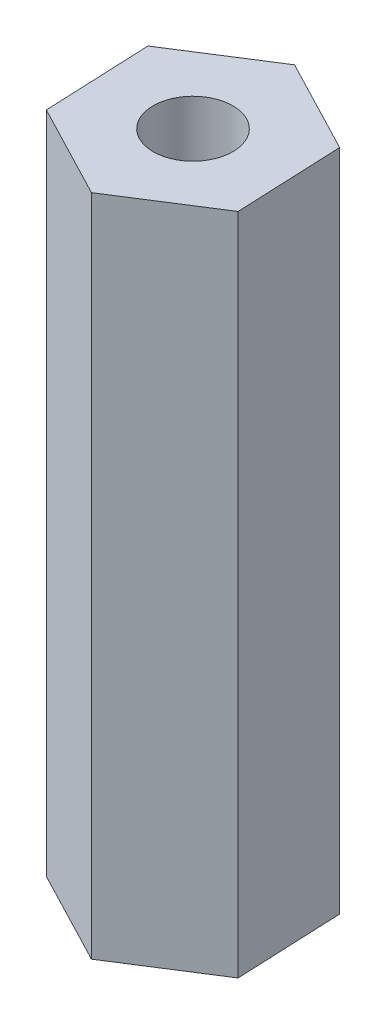
ISO-10303-21;
HEADER;
FILE_DESCRIPTION(('STEP AP214'),'2;1');
FILE_NAME('part.step','',(''),(''),'','','');
FILE_SCHEMA(('AUTOMOTIVE_DESIGN { 1 0 10303 214 1 1 1 1 }'));
ENDSEC;
DATA;
#1=APPLICATION_CONTEXT('core data for automotive mechanical design processes');
#2=APPLICATION_PROTOCOL_DEFINITION('international standard','automotive_design',2000,#1);
#3=PRODUCT_CONTEXT('',#1,'mechanical');
#4=PRODUCT('Part','Part','',(#3));
#5=PRODUCT_RELATED_PRODUCT_CATEGORY('part','',(#4));
#6=PRODUCT_DEFINITION_FORMATION('','',#4);
#7=PRODUCT_DEFINITION_CONTEXT('part definition',#1,'design');
#8=PRODUCT_DEFINITION('design','',#6,#7);
#9=PRODUCT_DEFINITION_SHAPE('','',#8);
#10=(LENGTH_UNIT() NAMED_UNIT(*) SI_UNIT(.MILLI.,.METRE.));
#11=(NAMED_UNIT(*) PLANE_ANGLE_UNIT() SI_UNIT($,.RADIAN.));
#12=(NAMED_UNIT(*) SI_UNIT($,.STERADIAN.) SOLID_ANGLE_UNIT());
#13=UNCERTAINTY_MEASURE_WITH_UNIT(LENGTH_MEASURE(1.E-05),#10,'distance_accuracy_value','');
#14=(GEOMETRIC_REPRESENTATION_CONTEXT(3) GLOBAL_UNCERTAINTY_ASSIGNED_CONTEXT((#13)) GLOBAL_UNIT_ASSIGNED_CONTEXT((#10,
#11,#12)) REPRESENTATION_CONTEXT('',''));
#15=CARTESIAN_POINT('',(0.,0.,0.));
#16=DIRECTION('',(0.,0.,1.));
#17=DIRECTION('',(1.,0.,0.));
#18=AXIS2_PLACEMENT_3D('',#15,#16,#17);
#19=CARTESIAN_POINT('',(-0.172247248955725,25.,-3.9962896398068));
#20=DIRECTION('',(0.53682882830776,0.,0.843691181118848));
#21=DIRECTION('',(0.843691181118848,0.,-0.53682882830776));
#22=AXIS2_PLACEMENT_3D('',#19,#20,#21);
#23=PLANE('',#22);
#24=DIRECTION('',(-0.843691181118848,0.,0.53682882830776));
#25=VECTOR('',#24,1.);
#26=CARTESIAN_POINT('',(-0.172247248955725,0.,-3.9962896398068));
#27=LINE('',#26,#25);
#28=CARTESIAN_POINT('',(-0.172247248955725,0.,-3.9962896398068));
#29=VERTEX_POINT('',#28);
#30=CARTESIAN_POINT('',(-3.54701197343112,0.,-1.84897432657576));
#31=VERTEX_POINT('',#30);
#32=EDGE_CURVE('E118',#29,#31,#27,.T.);
#33=ORIENTED_EDGE('',*,*,#32,.T.);
#34=DIRECTION('',(0.,-1.,0.));
#35=VECTOR('',#34,1.);
#36=CARTESIAN_POINT('',(-3.54701197343112,25.,-1.84897432657576));
#37=LINE('',#36,#35);
#38=CARTESIAN_POINT('',(-3.54701197343112,25.,-1.84897432657576));
#39=VERTEX_POINT('',#38);
#40=EDGE_CURVE('E11',#39,#31,#37,.T.);
#41=ORIENTED_EDGE('',*,*,#40,.F.);
#42=DIRECTION('',(-0.843691181118848,0.,0.53682882830776));
#43=VECTOR('',#42,1.);
#44=CARTESIAN_POINT('',(-0.172247248955725,25.,-3.9962896398068));
#45=LINE('',#44,#43);
#46=CARTESIAN_POINT('',(-0.172247248955725,25.,-3.9962896398068));
#47=VERTEX_POINT('',#46);
#48=EDGE_CURVE('E129',#47,#39,#45,.T.);
#49=ORIENTED_EDGE('',*,*,#48,.F.);
#50=DIRECTION('',(0.,-1.,0.));
#51=VECTOR('',#50,1.);
#52=CARTESIAN_POINT('',(-0.172247248955725,25.,-3.9962896398068));
#53=LINE('',#52,#51);
#54=EDGE_CURVE('E114',#47,#29,#53,.T.);
#55=ORIENTED_EDGE('',*,*,#54,.T.);
#56=EDGE_LOOP('',(#33,#41,#49,#55));
#57=FACE_BOUND('',#56,.T.);
#58=ADVANCED_FACE('F34',(#57),#23,.F.);
#59=CARTESIAN_POINT('',(-3.54701197343112,25.,-1.84897432657576));
#60=DIRECTION('',(0.999072409951701,0.,-0.0430618122389311));
#61=DIRECTION('',(-0.0430618122389311,0.,-0.999072409951701));
#62=AXIS2_PLACEMENT_3D('',#59,#60,#61);
#63=PLANE('',#62);
#64=DIRECTION('',(0.0430618122389311,0.,0.999072409951701));
#65=VECTOR('',#64,1.);
#66=CARTESIAN_POINT('',(-3.54701197343112,0.,-1.84897432657576));
#67=LINE('',#66,#65);
#68=CARTESIAN_POINT('',(-3.37476472447539,0.,2.14731531323104));
#69=VERTEX_POINT('',#68);
#70=EDGE_CURVE('E121',#31,#69,#67,.T.);
#71=ORIENTED_EDGE('',*,*,#70,.T.);
#72=DIRECTION('',(0.,-1.,0.));
#73=VECTOR('',#72,1.);
#74=CARTESIAN_POINT('',(-3.37476472447539,25.,2.14731531323104));
#75=LINE('',#74,#73);
#76=CARTESIAN_POINT('',(-3.37476472447539,25.,2.14731531323104));
#77=VERTEX_POINT('',#76);
#78=EDGE_CURVE('E42',#77,#69,#75,.T.);
#79=ORIENTED_EDGE('',*,*,#78,.F.);
#80=DIRECTION('',(0.0430618122389311,0.,0.999072409951701));
#81=VECTOR('',#80,1.);
#82=CARTESIAN_POINT('',(-3.54701197343112,25.,-1.84897432657576));
#83=LINE('',#82,#81);
#84=EDGE_CURVE('E87',#39,#77,#83,.T.);
#85=ORIENTED_EDGE('',*,*,#84,.F.);
#86=ORIENTED_EDGE('',*,*,#40,.T.);
#87=EDGE_LOOP('',(#71,#79,#85,#86));
#88=FACE_BOUND('',#87,.T.);
#89=ADVANCED_FACE('F154',(#88),#63,.F.);
#90=CARTESIAN_POINT('',(-3.37476472447539,25.,2.14731531323104));
#91=DIRECTION('',(0.462243581643941,0.,-0.886752993357779));
#92=DIRECTION('',(-0.886752993357779,0.,-0.462243581643941));
#93=AXIS2_PLACEMENT_3D('',#90,#91,#92);
#94=PLANE('',#93);
#95=DIRECTION('',(0.886752993357779,0.,0.462243581643941));
#96=VECTOR('',#95,1.);
#97=CARTESIAN_POINT('',(-3.37476472447539,0.,2.14731531323104));
#98=LINE('',#97,#96);
#99=CARTESIAN_POINT('',(0.172247248955723,0.,3.9962896398068));
#100=VERTEX_POINT('',#99);
#101=EDGE_CURVE('E124',#69,#100,#98,.T.);
#102=ORIENTED_EDGE('',*,*,#101,.T.);
#103=DIRECTION('',(0.,-1.,0.));
#104=VECTOR('',#103,1.);
#105=CARTESIAN_POINT('',(0.172247248955723,25.,3.9962896398068));
#106=LINE('',#105,#104);
#107=CARTESIAN_POINT('',(0.172247248955723,25.,3.9962896398068));
#108=VERTEX_POINT('',#107);
#109=EDGE_CURVE('E109',#108,#100,#106,.T.);
#110=ORIENTED_EDGE('',*,*,#109,.F.);
#111=DIRECTION('',(0.886752993357779,0.,0.462243581643941));
#112=VECTOR('',#111,1.);
#113=CARTESIAN_POINT('',(-3.37476472447539,25.,2.14731531323104));
#114=LINE('',#113,#112);
#115=EDGE_CURVE('E100',#77,#108,#114,.T.);
#116=ORIENTED_EDGE('',*,*,#115,.F.);
#117=ORIENTED_EDGE('',*,*,#78,.T.);
#118=EDGE_LOOP('',(#102,#110,#116,#117));
#119=FACE_BOUND('',#118,.T.);
#120=ADVANCED_FACE('F135',(#119),#94,.F.);
#121=CARTESIAN_POINT('',(0.172247248955723,25.,3.9962896398068));
#122=DIRECTION('',(-0.53682882830776,0.,-0.843691181118848));
#123=DIRECTION('',(-0.843691181118848,0.,0.53682882830776));
#124=AXIS2_PLACEMENT_3D('',#121,#122,#123);
#125=PLANE('',#124);
#126=DIRECTION('',(0.843691181118848,0.,-0.53682882830776));
#127=VECTOR('',#126,1.);
#128=CARTESIAN_POINT('',(0.172247248955723,0.,3.9962896398068));
#129=LINE('',#128,#127);
#130=CARTESIAN_POINT('',(3.54701197343112,0.,1.84897432657576));
#131=VERTEX_POINT('',#130);
#132=EDGE_CURVE('E108',#100,#131,#129,.T.);
#133=ORIENTED_EDGE('',*,*,#132,.T.);
#134=DIRECTION('',(0.,-1.,0.));
#135=VECTOR('',#134,1.);
#136=CARTESIAN_POINT('',(3.54701197343112,25.,1.84897432657576));
#137=LINE('',#136,#135);
#138=CARTESIAN_POINT('',(3.54701197343112,25.,1.84897432657576));
#139=VERTEX_POINT('',#138);
#140=EDGE_CURVE('E105',#139,#131,#137,.T.);
#141=ORIENTED_EDGE('',*,*,#140,.F.);
#142=DIRECTION('',(0.843691181118848,0.,-0.53682882830776));
#143=VECTOR('',#142,1.);
#144=CARTESIAN_POINT('',(0.172247248955723,25.,3.9962896398068));
#145=LINE('',#144,#143);
#146=EDGE_CURVE('E94',#108,#139,#145,.T.);
#147=ORIENTED_EDGE('',*,*,#146,.F.);
#148=ORIENTED_EDGE('',*,*,#109,.T.);
#149=EDGE_LOOP('',(#133,#141,#147,#148));
#150=FACE_BOUND('',#149,.T.);
#151=ADVANCED_FACE('F106',(#150),#125,.F.);
#152=CARTESIAN_POINT('',(3.54701197343112,25.,1.84897432657576));
#153=DIRECTION('',(-0.999072409951701,0.,0.043061812238931));
#154=DIRECTION('',(0.043061812238931,0.,0.999072409951701));
#155=AXIS2_PLACEMENT_3D('',#152,#153,#154);
#156=PLANE('',#155);
#157=DIRECTION('',(-0.043061812238931,0.,-0.999072409951701));
#158=VECTOR('',#157,1.);
#159=CARTESIAN_POINT('',(3.54701197343112,0.,1.84897432657576));
#160=LINE('',#159,#158);
#161=CARTESIAN_POINT('',(3.37476472447539,0.,-2.14731531323104));
#162=VERTEX_POINT('',#161);
#163=EDGE_CURVE('E73',#131,#162,#160,.T.);
#164=ORIENTED_EDGE('',*,*,#163,.T.);
#165=DIRECTION('',(0.,-1.,0.));
#166=VECTOR('',#165,1.);
#167=CARTESIAN_POINT('',(3.37476472447539,25.,-2.14731531323104));
#168=LINE('',#167,#166);
#169=CARTESIAN_POINT('',(3.37476472447539,25.,-2.14731531323104));
#170=VERTEX_POINT('',#169);
#171=EDGE_CURVE('E110',#170,#162,#168,.T.);
#172=ORIENTED_EDGE('',*,*,#171,.F.);
#173=DIRECTION('',(-0.043061812238931,0.,-0.999072409951701));
#174=VECTOR('',#173,1.);
#175=CARTESIAN_POINT('',(3.54701197343112,25.,1.84897432657576));
#176=LINE('',#175,#174);
#177=EDGE_CURVE('E98',#139,#170,#176,.T.);
#178=ORIENTED_EDGE('',*,*,#177,.F.);
#179=ORIENTED_EDGE('',*,*,#140,.T.);
#180=EDGE_LOOP('',(#164,#172,#178,#179));
#181=FACE_BOUND('',#180,.T.);
#182=ADVANCED_FACE('F112',(#181),#156,.F.);
#183=CARTESIAN_POINT('',(3.37476472447539,25.,-2.14731531323104));
#184=DIRECTION('',(-0.46224358164394,0.,0.886752993357779));
#185=DIRECTION('',(0.886752993357779,0.,0.46224358164394));
#186=AXIS2_PLACEMENT_3D('',#183,#184,#185);
#187=PLANE('',#186);
#188=DIRECTION('',(-0.886752993357779,0.,-0.46224358164394));
#189=VECTOR('',#188,1.);
#190=CARTESIAN_POINT('',(3.37476472447539,0.,-2.14731531323104));
#191=LINE('',#190,#189);
#192=EDGE_CURVE('E79',#162,#29,#191,.T.);
#193=ORIENTED_EDGE('',*,*,#192,.T.);
#194=ORIENTED_EDGE('',*,*,#54,.F.);
#195=DIRECTION('',(-0.886752993357779,0.,-0.46224358164394));
#196=VECTOR('',#195,1.);
#197=CARTESIAN_POINT('',(3.37476472447539,25.,-2.14731531323104));
#198=LINE('',#197,#196);
#199=EDGE_CURVE('E50',#170,#47,#198,.T.);
#200=ORIENTED_EDGE('',*,*,#199,.F.);
#201=ORIENTED_EDGE('',*,*,#171,.T.);
#202=EDGE_LOOP('',(#193,#194,#200,#201));
#203=FACE_BOUND('',#202,.T.);
#204=ADVANCED_FACE('F142',(#203),#187,.F.);
#205=CARTESIAN_POINT('',(0.,25.,0.));
#206=DIRECTION('',(0.,1.,0.));
#207=DIRECTION('',(0.,0.,1.));
#208=AXIS2_PLACEMENT_3D('',#205,#206,#207);
#209=PLANE('',#208);
#210=CARTESIAN_POINT('',(0.,25.,0.));
#211=DIRECTION('',(0.,1.,0.));
#212=DIRECTION('',(0.,0.,1.));
#213=AXIS2_PLACEMENT_3D('',#210,#211,#212);
#214=CIRCLE('',#213,1.5);
#215=CARTESIAN_POINT('',(0.,25.,1.5));
#216=VERTEX_POINT('',#215);
#217=EDGE_CURVE('E209',#216,#216,#214,.T.);
#218=ORIENTED_EDGE('',*,*,#217,.F.);
#219=EDGE_LOOP('',(#218));
#220=FACE_BOUND('',#219,.T.);
#221=ORIENTED_EDGE('',*,*,#48,.T.);
#222=ORIENTED_EDGE('',*,*,#84,.T.);
#223=ORIENTED_EDGE('',*,*,#115,.T.);
#224=ORIENTED_EDGE('',*,*,#146,.T.);
#225=ORIENTED_EDGE('',*,*,#177,.T.);
#226=ORIENTED_EDGE('',*,*,#199,.T.);
#227=EDGE_LOOP('',(#221,#222,#223,#224,#225,#226));
#228=FACE_BOUND('',#227,.T.);
#229=ADVANCED_FACE('F96',(#220,#228),#209,.T.);
#230=CARTESIAN_POINT('',(0.,0.,0.));
#231=DIRECTION('',(0.,1.,0.));
#232=DIRECTION('',(0.,0.,1.));
#233=AXIS2_PLACEMENT_3D('',#230,#231,#232);
#234=PLANE('',#233);
#235=CARTESIAN_POINT('',(0.,0.,0.));
#236=DIRECTION('',(0.,1.,0.));
#237=DIRECTION('',(0.,0.,1.));
#238=AXIS2_PLACEMENT_3D('',#235,#236,#237);
#239=CIRCLE('',#238,1.5);
#240=CARTESIAN_POINT('',(0.,0.,1.5));
#241=VERTEX_POINT('',#240);
#242=EDGE_CURVE('E122',#241,#241,#239,.T.);
#243=ORIENTED_EDGE('',*,*,#242,.T.);
#244=EDGE_LOOP('',(#243));
#245=FACE_BOUND('',#244,.T.);
#246=ORIENTED_EDGE('',*,*,#32,.F.);
#247=ORIENTED_EDGE('',*,*,#192,.F.);
#248=ORIENTED_EDGE('',*,*,#163,.F.);
#249=ORIENTED_EDGE('',*,*,#132,.F.);
#250=ORIENTED_EDGE('',*,*,#101,.F.);
#251=ORIENTED_EDGE('',*,*,#70,.F.);
#252=EDGE_LOOP('',(#246,#247,#248,#249,#250,#251));
#253=FACE_BOUND('',#252,.T.);
#254=ADVANCED_FACE('F138',(#245,#253),#234,.F.);
#255=CARTESIAN_POINT('',(0.,0.,0.));
#256=DIRECTION('',(0.,1.,0.));
#257=DIRECTION('',(0.,0.,1.));
#258=AXIS2_PLACEMENT_3D('',#255,#256,#257);
#259=CYLINDRICAL_SURFACE('',#258,1.5);
#260=ORIENTED_EDGE('',*,*,#242,.F.);
#261=EDGE_LOOP('',(#260));
#262=FACE_BOUND('',#261,.T.);
#263=ORIENTED_EDGE('',*,*,#217,.T.);
#264=EDGE_LOOP('',(#263));
#265=FACE_BOUND('',#264,.T.);
#266=ADVANCED_FACE('F191',(#262,#265),#259,.F.);
#267=CLOSED_SHELL('',(#58,#89,#120,#151,#182,#204,#229,#254,#266));
#268=MANIFOLD_SOLID_BREP('B2',#267);
#269=ADVANCED_BREP_SHAPE_REPRESENTATION('',(#18,#268),#14);
#270=SHAPE_DEFINITION_REPRESENTATION(#9,#269);
ENDSEC;
END-ISO-10303-21;
